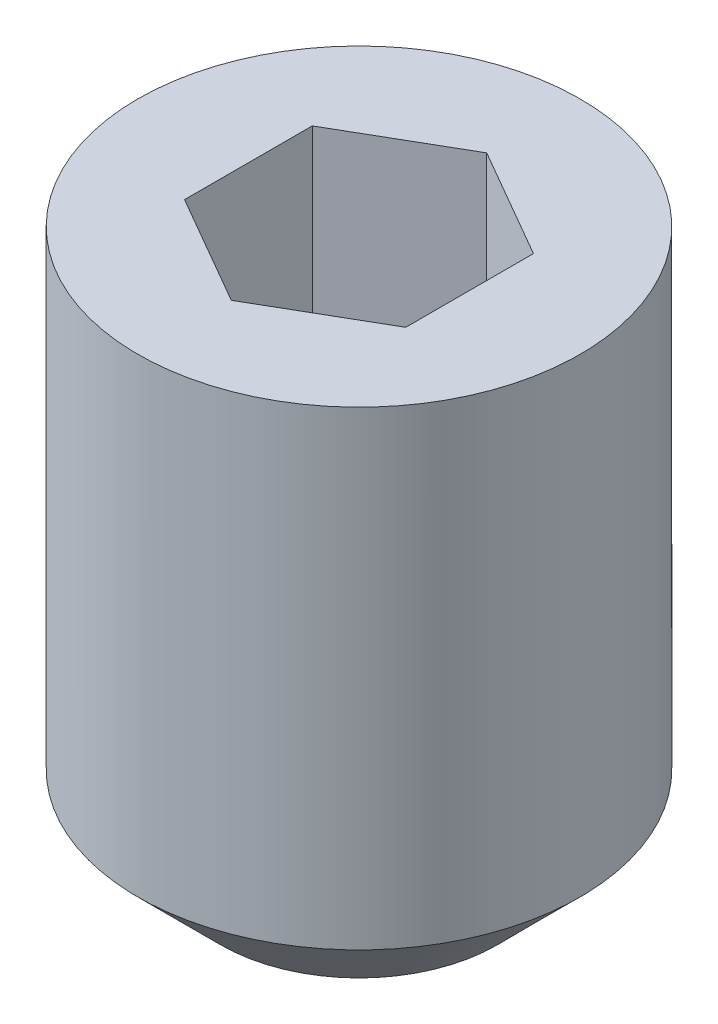
ISO-10303-21;
HEADER;
FILE_DESCRIPTION(('STEP AP214'),'2;1');
FILE_NAME('part.step','',(''),(''),'','','');
FILE_SCHEMA(('AUTOMOTIVE_DESIGN { 1 0 10303 214 1 1 1 1 }'));
ENDSEC;
DATA;
#1=APPLICATION_CONTEXT('core data for automotive mechanical design processes');
#2=APPLICATION_PROTOCOL_DEFINITION('international standard','automotive_design',2000,#1);
#3=PRODUCT_CONTEXT('',#1,'mechanical');
#4=PRODUCT('Part','Part','',(#3));
#5=PRODUCT_RELATED_PRODUCT_CATEGORY('part','',(#4));
#6=PRODUCT_DEFINITION_FORMATION('','',#4);
#7=PRODUCT_DEFINITION_CONTEXT('part definition',#1,'design');
#8=PRODUCT_DEFINITION('design','',#6,#7);
#9=PRODUCT_DEFINITION_SHAPE('','',#8);
#10=(LENGTH_UNIT() NAMED_UNIT(*) SI_UNIT(.MILLI.,.METRE.));
#11=(NAMED_UNIT(*) PLANE_ANGLE_UNIT() SI_UNIT($,.RADIAN.));
#12=(NAMED_UNIT(*) SI_UNIT($,.STERADIAN.) SOLID_ANGLE_UNIT());
#13=UNCERTAINTY_MEASURE_WITH_UNIT(LENGTH_MEASURE(1.E-05),#10,'distance_accuracy_value','');
#14=(GEOMETRIC_REPRESENTATION_CONTEXT(3) GLOBAL_UNCERTAINTY_ASSIGNED_CONTEXT((#13)) GLOBAL_UNIT_ASSIGNED_CONTEXT((#10,
#11,#12)) REPRESENTATION_CONTEXT('',''));
#15=CARTESIAN_POINT('',(0.,0.,0.));
#16=DIRECTION('',(0.,0.,1.));
#17=DIRECTION('',(1.,0.,0.));
#18=AXIS2_PLACEMENT_3D('',#15,#16,#17);
#19=CARTESIAN_POINT('',(0.,5.,0.));
#20=DIRECTION('',(0.,-1.,0.));
#21=DIRECTION('',(1.,0.,0.));
#22=AXIS2_PLACEMENT_3D('',#19,#20,#21);
#23=PLANE('',#22);
#24=CARTESIAN_POINT('',(0.,5.,0.));
#25=DIRECTION('',(0.,1.,0.));
#26=DIRECTION('',(-1.,0.,0.));
#27=AXIS2_PLACEMENT_3D('',#24,#25,#26);
#28=CIRCLE('',#27,2.);
#29=CARTESIAN_POINT('',(-2.,5.,0.));
#30=VERTEX_POINT('',#29);
#31=EDGE_CURVE('E11',#30,#30,#28,.T.);
#32=ORIENTED_EDGE('',*,*,#31,.T.);
#33=EDGE_LOOP('',(#32));
#34=FACE_BOUND('',#33,.T.);
#35=DIRECTION('',(-0.866025403784439,0.,0.5));
#36=VECTOR('',#35,1.);
#37=CARTESIAN_POINT('',(0.,5.,-1.15470053837925));
#38=LINE('',#37,#36);
#39=CARTESIAN_POINT('',(0.,5.,-1.15470053837925));
#40=VERTEX_POINT('',#39);
#41=CARTESIAN_POINT('',(-0.999999999999999,5.,-0.577350269189626));
#42=VERTEX_POINT('',#41);
#43=EDGE_CURVE('E150',#40,#42,#38,.T.);
#44=ORIENTED_EDGE('',*,*,#43,.F.);
#45=DIRECTION('',(-0.866025403784439,0.,-0.5));
#46=VECTOR('',#45,1.);
#47=CARTESIAN_POINT('',(0.999999999999999,5.,-0.577350269189626));
#48=LINE('',#47,#46);
#49=CARTESIAN_POINT('',(0.999999999999999,5.,-0.577350269189626));
#50=VERTEX_POINT('',#49);
#51=EDGE_CURVE('E50',#50,#40,#48,.T.);
#52=ORIENTED_EDGE('',*,*,#51,.F.);
#53=DIRECTION('',(0.,0.,-1.));
#54=VECTOR('',#53,1.);
#55=CARTESIAN_POINT('',(0.999999999999999,5.,0.577350269189626));
#56=LINE('',#55,#54);
#57=CARTESIAN_POINT('',(0.999999999999999,5.,0.577350269189626));
#58=VERTEX_POINT('',#57);
#59=EDGE_CURVE('E120',#58,#50,#56,.T.);
#60=ORIENTED_EDGE('',*,*,#59,.F.);
#61=DIRECTION('',(0.866025403784439,0.,-0.5));
#62=VECTOR('',#61,1.);
#63=CARTESIAN_POINT('',(0.,5.,1.15470053837925));
#64=LINE('',#63,#62);
#65=CARTESIAN_POINT('',(0.,5.,1.15470053837925));
#66=VERTEX_POINT('',#65);
#67=EDGE_CURVE('E158',#66,#58,#64,.T.);
#68=ORIENTED_EDGE('',*,*,#67,.F.);
#69=DIRECTION('',(0.866025403784439,0.,0.5));
#70=VECTOR('',#69,1.);
#71=CARTESIAN_POINT('',(-0.999999999999999,5.,0.577350269189626));
#72=LINE('',#71,#70);
#73=CARTESIAN_POINT('',(-0.999999999999999,5.,0.577350269189626));
#74=VERTEX_POINT('',#73);
#75=EDGE_CURVE('E155',#74,#66,#72,.T.);
#76=ORIENTED_EDGE('',*,*,#75,.F.);
#77=DIRECTION('',(0.,0.,1.));
#78=VECTOR('',#77,1.);
#79=CARTESIAN_POINT('',(-0.999999999999999,5.,-0.577350269189626));
#80=LINE('',#79,#78);
#81=EDGE_CURVE('E153',#42,#74,#80,.T.);
#82=ORIENTED_EDGE('',*,*,#81,.F.);
#83=EDGE_LOOP('',(#44,#52,#60,#68,#76,#82));
#84=FACE_BOUND('',#83,.T.);
#85=ADVANCED_FACE('F36',(#34,#84),#23,.F.);
#86=CARTESIAN_POINT('',(0.,5.,0.));
#87=DIRECTION('',(0.,1.,0.));
#88=DIRECTION('',(-1.,0.,0.));
#89=AXIS2_PLACEMENT_3D('',#86,#87,#88);
#90=CYLINDRICAL_SURFACE('',#89,2.);
#91=CARTESIAN_POINT('',(0.,0.749999999999992,0.));
#92=DIRECTION('',(0.,-1.,0.));
#93=DIRECTION('',(0.,0.,-1.));
#94=AXIS2_PLACEMENT_3D('',#91,#92,#93);
#95=CIRCLE('',#94,2.);
#96=CARTESIAN_POINT('',(0.,0.749999999999992,-2.));
#97=VERTEX_POINT('',#96);
#98=EDGE_CURVE('E359',#97,#97,#95,.T.);
#99=ORIENTED_EDGE('',*,*,#98,.F.);
#100=EDGE_LOOP('',(#99));
#101=FACE_BOUND('',#100,.T.);
#102=ORIENTED_EDGE('',*,*,#31,.F.);
#103=EDGE_LOOP('',(#102));
#104=FACE_BOUND('',#103,.T.);
#105=ADVANCED_FACE('F219',(#101,#104),#90,.T.);
#106=CARTESIAN_POINT('',(0.999999999999999,3.5,-0.577350269189626));
#107=DIRECTION('',(0.5,0.,-0.866025403784439));
#108=DIRECTION('',(-0.866025403784439,0.,-0.5));
#109=AXIS2_PLACEMENT_3D('',#106,#107,#108);
#110=PLANE('',#109);
#111=DIRECTION('',(-0.866025403784439,0.,-0.5));
#112=VECTOR('',#111,1.);
#113=CARTESIAN_POINT('',(0.999999999999999,3.5,-0.577350269189626));
#114=LINE('',#113,#112);
#115=CARTESIAN_POINT('',(0.999999999999999,3.5,-0.577350269189626));
#116=VERTEX_POINT('',#115);
#117=CARTESIAN_POINT('',(0.499999999999999,3.5,-0.866025403784438));
#118=VERTEX_POINT('',#117);
#119=EDGE_CURVE('E119',#116,#118,#114,.T.);
#120=ORIENTED_EDGE('',*,*,#119,.F.);
#121=DIRECTION('',(0.,1.,0.));
#122=VECTOR('',#121,1.);
#123=CARTESIAN_POINT('',(0.999999999999999,3.5,-0.577350269189626));
#124=LINE('',#123,#122);
#125=EDGE_CURVE('E161',#116,#50,#124,.T.);
#126=ORIENTED_EDGE('',*,*,#125,.T.);
#127=ORIENTED_EDGE('',*,*,#51,.T.);
#128=DIRECTION('',(0.,1.,0.));
#129=VECTOR('',#128,1.);
#130=CARTESIAN_POINT('',(0.,3.5,-1.15470053837925));
#131=LINE('',#130,#129);
#132=CARTESIAN_POINT('',(0.,3.5,-1.15470053837925));
#133=VERTEX_POINT('',#132);
#134=EDGE_CURVE('E122',#133,#40,#131,.T.);
#135=ORIENTED_EDGE('',*,*,#134,.F.);
#136=EDGE_CURVE('E111',#118,#133,#114,.T.);
#137=ORIENTED_EDGE('',*,*,#136,.F.);
#138=EDGE_LOOP('',(#120,#126,#127,#135,#137));
#139=FACE_BOUND('',#138,.T.);
#140=ADVANCED_FACE('F123',(#139),#110,.F.);
#141=CARTESIAN_POINT('',(0.999999999999999,3.5,0.577350269189626));
#142=DIRECTION('',(1.,0.,0.));
#143=DIRECTION('',(0.,0.,-1.));
#144=AXIS2_PLACEMENT_3D('',#141,#142,#143);
#145=PLANE('',#144);
#146=DIRECTION('',(0.,0.,-1.));
#147=VECTOR('',#146,1.);
#148=CARTESIAN_POINT('',(0.999999999999999,3.5,0.577350269189626));
#149=LINE('',#148,#147);
#150=CARTESIAN_POINT('',(0.999999999999999,3.5,0.577350269189626));
#151=VERTEX_POINT('',#150);
#152=CARTESIAN_POINT('',(0.999999999999998,3.5,0.));
#153=VERTEX_POINT('',#152);
#154=EDGE_CURVE('E127',#151,#153,#149,.T.);
#155=ORIENTED_EDGE('',*,*,#154,.F.);
#156=DIRECTION('',(0.,1.,0.));
#157=VECTOR('',#156,1.);
#158=CARTESIAN_POINT('',(0.999999999999999,3.5,0.577350269189626));
#159=LINE('',#158,#157);
#160=EDGE_CURVE('E164',#151,#58,#159,.T.);
#161=ORIENTED_EDGE('',*,*,#160,.T.);
#162=ORIENTED_EDGE('',*,*,#59,.T.);
#163=ORIENTED_EDGE('',*,*,#125,.F.);
#164=EDGE_CURVE('E146',#153,#116,#149,.T.);
#165=ORIENTED_EDGE('',*,*,#164,.F.);
#166=EDGE_LOOP('',(#155,#161,#162,#163,#165));
#167=FACE_BOUND('',#166,.T.);
#168=ADVANCED_FACE('F192',(#167),#145,.F.);
#169=CARTESIAN_POINT('',(0.,3.5,1.15470053837925));
#170=DIRECTION('',(0.5,0.,0.866025403784439));
#171=DIRECTION('',(0.866025403784439,0.,-0.5));
#172=AXIS2_PLACEMENT_3D('',#169,#170,#171);
#173=PLANE('',#172);
#174=DIRECTION('',(0.866025403784439,0.,-0.5));
#175=VECTOR('',#174,1.);
#176=CARTESIAN_POINT('',(0.,3.5,1.15470053837925));
#177=LINE('',#176,#175);
#178=CARTESIAN_POINT('',(0.,3.5,1.15470053837925));
#179=VERTEX_POINT('',#178);
#180=CARTESIAN_POINT('',(0.499999999999999,3.5,0.866025403784439));
#181=VERTEX_POINT('',#180);
#182=EDGE_CURVE('E58',#179,#181,#177,.T.);
#183=ORIENTED_EDGE('',*,*,#182,.F.);
#184=DIRECTION('',(0.,1.,0.));
#185=VECTOR('',#184,1.);
#186=CARTESIAN_POINT('',(0.,3.5,1.15470053837925));
#187=LINE('',#186,#185);
#188=EDGE_CURVE('E167',#179,#66,#187,.T.);
#189=ORIENTED_EDGE('',*,*,#188,.T.);
#190=ORIENTED_EDGE('',*,*,#67,.T.);
#191=ORIENTED_EDGE('',*,*,#160,.F.);
#192=EDGE_CURVE('E144',#181,#151,#177,.T.);
#193=ORIENTED_EDGE('',*,*,#192,.F.);
#194=EDGE_LOOP('',(#183,#189,#190,#191,#193));
#195=FACE_BOUND('',#194,.T.);
#196=ADVANCED_FACE('F247',(#195),#173,.F.);
#197=CARTESIAN_POINT('',(-0.999999999999999,3.5,0.577350269189626));
#198=DIRECTION('',(-0.5,0.,0.866025403784438));
#199=DIRECTION('',(0.866025403784439,0.,0.5));
#200=AXIS2_PLACEMENT_3D('',#197,#198,#199);
#201=PLANE('',#200);
#202=DIRECTION('',(0.866025403784439,0.,0.5));
#203=VECTOR('',#202,1.);
#204=CARTESIAN_POINT('',(-0.999999999999999,3.5,0.577350269189626));
#205=LINE('',#204,#203);
#206=CARTESIAN_POINT('',(-0.999999999999999,3.5,0.577350269189626));
#207=VERTEX_POINT('',#206);
#208=CARTESIAN_POINT('',(-0.5,3.5,0.866025403784438));
#209=VERTEX_POINT('',#208);
#210=EDGE_CURVE('E141',#207,#209,#205,.T.);
#211=ORIENTED_EDGE('',*,*,#210,.F.);
#212=DIRECTION('',(0.,1.,0.));
#213=VECTOR('',#212,1.);
#214=CARTESIAN_POINT('',(-0.999999999999999,3.5,0.577350269189626));
#215=LINE('',#214,#213);
#216=EDGE_CURVE('E170',#207,#74,#215,.T.);
#217=ORIENTED_EDGE('',*,*,#216,.T.);
#218=ORIENTED_EDGE('',*,*,#75,.T.);
#219=ORIENTED_EDGE('',*,*,#188,.F.);
#220=EDGE_CURVE('E140',#209,#179,#205,.T.);
#221=ORIENTED_EDGE('',*,*,#220,.F.);
#222=EDGE_LOOP('',(#211,#217,#218,#219,#221));
#223=FACE_BOUND('',#222,.T.);
#224=ADVANCED_FACE('F244',(#223),#201,.F.);
#225=CARTESIAN_POINT('',(-0.999999999999999,3.5,-0.577350269189626));
#226=DIRECTION('',(-1.,0.,0.));
#227=DIRECTION('',(0.,-1.,0.));
#228=AXIS2_PLACEMENT_3D('',#225,#226,#227);
#229=PLANE('',#228);
#230=DIRECTION('',(0.,0.,1.));
#231=VECTOR('',#230,1.);
#232=CARTESIAN_POINT('',(-0.999999999999999,3.5,-0.577350269189626));
#233=LINE('',#232,#231);
#234=CARTESIAN_POINT('',(-0.999999999999999,3.5,-0.577350269189626));
#235=VERTEX_POINT('',#234);
#236=CARTESIAN_POINT('',(-0.999999999999999,3.5,0.));
#237=VERTEX_POINT('',#236);
#238=EDGE_CURVE('E135',#235,#237,#233,.T.);
#239=ORIENTED_EDGE('',*,*,#238,.F.);
#240=DIRECTION('',(0.,1.,0.));
#241=VECTOR('',#240,1.);
#242=CARTESIAN_POINT('',(-0.999999999999999,3.5,-0.577350269189626));
#243=LINE('',#242,#241);
#244=EDGE_CURVE('E126',#235,#42,#243,.T.);
#245=ORIENTED_EDGE('',*,*,#244,.T.);
#246=ORIENTED_EDGE('',*,*,#81,.T.);
#247=ORIENTED_EDGE('',*,*,#216,.F.);
#248=EDGE_CURVE('E133',#237,#207,#233,.T.);
#249=ORIENTED_EDGE('',*,*,#248,.F.);
#250=EDGE_LOOP('',(#239,#245,#246,#247,#249));
#251=FACE_BOUND('',#250,.T.);
#252=ADVANCED_FACE('F202',(#251),#229,.F.);
#253=CARTESIAN_POINT('',(0.,3.5,-1.15470053837925));
#254=DIRECTION('',(-0.5,0.,-0.866025403784438));
#255=DIRECTION('',(-0.866025403784439,0.,0.5));
#256=AXIS2_PLACEMENT_3D('',#253,#254,#255);
#257=PLANE('',#256);
#258=DIRECTION('',(-0.866025403784439,0.,0.5));
#259=VECTOR('',#258,1.);
#260=CARTESIAN_POINT('',(0.,3.5,-1.15470053837925));
#261=LINE('',#260,#259);
#262=CARTESIAN_POINT('',(-0.5,3.5,-0.866025403784438));
#263=VERTEX_POINT('',#262);
#264=EDGE_CURVE('E114',#133,#263,#261,.T.);
#265=ORIENTED_EDGE('',*,*,#264,.F.);
#266=ORIENTED_EDGE('',*,*,#134,.T.);
#267=ORIENTED_EDGE('',*,*,#43,.T.);
#268=ORIENTED_EDGE('',*,*,#244,.F.);
#269=EDGE_CURVE('E132',#263,#235,#261,.T.);
#270=ORIENTED_EDGE('',*,*,#269,.F.);
#271=EDGE_LOOP('',(#265,#266,#267,#268,#270));
#272=FACE_BOUND('',#271,.T.);
#273=ADVANCED_FACE('F130',(#272),#257,.F.);
#274=CARTESIAN_POINT('',(0.,3.5,0.));
#275=DIRECTION('',(0.,1.,0.));
#276=DIRECTION('',(0.,0.,1.));
#277=AXIS2_PLACEMENT_3D('',#274,#275,#276);
#278=PLANE('',#277);
#279=ORIENTED_EDGE('',*,*,#192,.T.);
#280=ORIENTED_EDGE('',*,*,#154,.T.);
#281=CARTESIAN_POINT('',(0.,3.5,0.));
#282=DIRECTION('',(0.,1.,0.));
#283=DIRECTION('',(-1.,0.,0.));
#284=AXIS2_PLACEMENT_3D('',#281,#282,#283);
#285=CIRCLE('',#284,1.);
#286=EDGE_CURVE('E179',#181,#153,#285,.T.);
#287=ORIENTED_EDGE('',*,*,#286,.F.);
#288=EDGE_LOOP('',(#279,#280,#287));
#289=FACE_BOUND('',#288,.T.);
#290=ADVANCED_FACE('F187',(#289),#278,.T.);
#291=ORIENTED_EDGE('',*,*,#164,.T.);
#292=ORIENTED_EDGE('',*,*,#119,.T.);
#293=EDGE_CURVE('E180',#153,#118,#285,.T.);
#294=ORIENTED_EDGE('',*,*,#293,.F.);
#295=EDGE_LOOP('',(#291,#292,#294));
#296=FACE_BOUND('',#295,.T.);
#297=ADVANCED_FACE('F196',(#296),#278,.T.);
#298=ORIENTED_EDGE('',*,*,#136,.T.);
#299=ORIENTED_EDGE('',*,*,#264,.T.);
#300=EDGE_CURVE('E116',#118,#263,#285,.T.);
#301=ORIENTED_EDGE('',*,*,#300,.F.);
#302=EDGE_LOOP('',(#298,#299,#301));
#303=FACE_BOUND('',#302,.T.);
#304=ADVANCED_FACE('F112',(#303),#278,.T.);
#305=ORIENTED_EDGE('',*,*,#269,.T.);
#306=ORIENTED_EDGE('',*,*,#238,.T.);
#307=EDGE_CURVE('E163',#263,#237,#285,.T.);
#308=ORIENTED_EDGE('',*,*,#307,.F.);
#309=EDGE_LOOP('',(#305,#306,#308));
#310=FACE_BOUND('',#309,.T.);
#311=ADVANCED_FACE('F206',(#310),#278,.T.);
#312=ORIENTED_EDGE('',*,*,#248,.T.);
#313=ORIENTED_EDGE('',*,*,#210,.T.);
#314=EDGE_CURVE('E43',#237,#209,#285,.T.);
#315=ORIENTED_EDGE('',*,*,#314,.F.);
#316=EDGE_LOOP('',(#312,#313,#315));
#317=FACE_BOUND('',#316,.T.);
#318=ADVANCED_FACE('F208',(#317),#278,.T.);
#319=ORIENTED_EDGE('',*,*,#220,.T.);
#320=ORIENTED_EDGE('',*,*,#182,.T.);
#321=EDGE_CURVE('E175',#209,#181,#285,.T.);
#322=ORIENTED_EDGE('',*,*,#321,.F.);
#323=EDGE_LOOP('',(#319,#320,#322));
#324=FACE_BOUND('',#323,.T.);
#325=ADVANCED_FACE('F214',(#324),#278,.T.);
#326=CARTESIAN_POINT('',(0.,2.92264973081038,0.));
#327=DIRECTION('',(0.,1.,0.));
#328=DIRECTION('',(-1.,0.,0.));
#329=AXIS2_PLACEMENT_3D('',#326,#327,#328);
#330=CONICAL_SURFACE('',#329,0.,1.0471975511966);
#331=ORIENTED_EDGE('',*,*,#314,.T.);
#332=ORIENTED_EDGE('',*,*,#321,.T.);
#333=ORIENTED_EDGE('',*,*,#286,.T.);
#334=ORIENTED_EDGE('',*,*,#293,.T.);
#335=ORIENTED_EDGE('',*,*,#300,.T.);
#336=ORIENTED_EDGE('',*,*,#307,.T.);
#337=EDGE_LOOP('',(#331,#332,#333,#334,#335,#336));
#338=FACE_BOUND('',#337,.T.);
#339=CARTESIAN_POINT('',(0.,2.92264973081038,0.));
#340=VERTEX_POINT('',#339);
#341=VERTEX_LOOP('',#340);
#342=FACE_BOUND('',#341,.T.);
#343=ADVANCED_FACE('F184',(#338,#342),#330,.F.);
#344=CARTESIAN_POINT('',(0.,0.749999999999992,0.));
#345=DIRECTION('',(0.,1.,0.));
#346=DIRECTION('',(0.,0.,1.));
#347=AXIS2_PLACEMENT_3D('',#344,#345,#346);
#348=CONICAL_SURFACE('',#347,2.,0.785398163397453);
#349=CARTESIAN_POINT('',(0.,0.,0.));
#350=DIRECTION('',(0.,-1.,0.));
#351=DIRECTION('',(0.,0.,-1.));
#352=AXIS2_PLACEMENT_3D('',#349,#350,#351);
#353=CIRCLE('',#352,1.25);
#354=CARTESIAN_POINT('',(0.,0.,-1.25));
#355=VERTEX_POINT('',#354);
#356=EDGE_CURVE('E151',#355,#355,#353,.T.);
#357=ORIENTED_EDGE('',*,*,#356,.F.);
#358=EDGE_LOOP('',(#357));
#359=FACE_BOUND('',#358,.T.);
#360=ORIENTED_EDGE('',*,*,#98,.T.);
#361=EDGE_LOOP('',(#360));
#362=FACE_BOUND('',#361,.T.);
#363=ADVANCED_FACE('F236',(#359,#362),#348,.T.);
#364=CARTESIAN_POINT('',(2.,0.,0.));
#365=DIRECTION('',(0.,1.,0.));
#366=DIRECTION('',(-1.,0.,0.));
#367=AXIS2_PLACEMENT_3D('',#364,#365,#366);
#368=PLANE('',#367);
#369=ORIENTED_EDGE('',*,*,#356,.T.);
#370=EDGE_LOOP('',(#369));
#371=FACE_BOUND('',#370,.T.);
#372=ADVANCED_FACE('F233',(#371),#368,.F.);
#373=CLOSED_SHELL('',(#85,#105,#140,#168,#196,#224,#252,#273,#290,#297,#304,#311,#318,#325,#343,
#363,#372));
#374=MANIFOLD_SOLID_BREP('B2',#373);
#375=ADVANCED_BREP_SHAPE_REPRESENTATION('',(#18,#374),#14);
#376=SHAPE_DEFINITION_REPRESENTATION(#9,#375);
ENDSEC;
END-ISO-10303-21;
